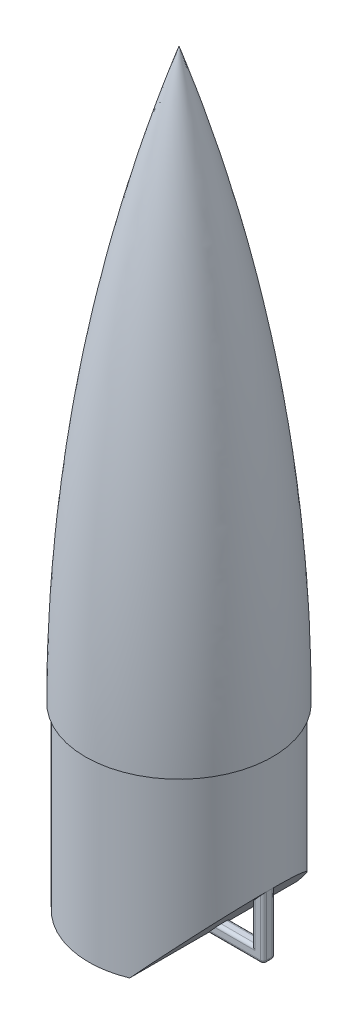
ISO-10303-21;
HEADER;
FILE_DESCRIPTION(('STEP AP214'),'2;1');
FILE_NAME('part.step','',(''),(''),'','','');
FILE_SCHEMA(('AUTOMOTIVE_DESIGN { 1 0 10303 214 1 1 1 1 }'));
ENDSEC;
DATA;
#1=APPLICATION_CONTEXT('core data for automotive mechanical design processes');
#2=APPLICATION_PROTOCOL_DEFINITION('international standard','automotive_design',2000,#1);
#3=PRODUCT_CONTEXT('',#1,'mechanical');
#4=PRODUCT('Part','Part','',(#3));
#5=PRODUCT_RELATED_PRODUCT_CATEGORY('part','',(#4));
#6=PRODUCT_DEFINITION_FORMATION('','',#4);
#7=PRODUCT_DEFINITION_CONTEXT('part definition',#1,'design');
#8=PRODUCT_DEFINITION('design','',#6,#7);
#9=PRODUCT_DEFINITION_SHAPE('','',#8);
#10=(LENGTH_UNIT() NAMED_UNIT(*) SI_UNIT(.MILLI.,.METRE.));
#11=(NAMED_UNIT(*) PLANE_ANGLE_UNIT() SI_UNIT($,.RADIAN.));
#12=(NAMED_UNIT(*) SI_UNIT($,.STERADIAN.) SOLID_ANGLE_UNIT());
#13=UNCERTAINTY_MEASURE_WITH_UNIT(LENGTH_MEASURE(1.E-05),#10,'distance_accuracy_value','');
#14=(GEOMETRIC_REPRESENTATION_CONTEXT(3) GLOBAL_UNCERTAINTY_ASSIGNED_CONTEXT((#13)) GLOBAL_UNIT_ASSIGNED_CONTEXT((#10,
#11,#12)) REPRESENTATION_CONTEXT('',''));
#15=CARTESIAN_POINT('',(0.,0.,0.));
#16=DIRECTION('',(0.,0.,1.));
#17=DIRECTION('',(1.,0.,0.));
#18=AXIS2_PLACEMENT_3D('',#15,#16,#17);
#19=CARTESIAN_POINT('',(0.,-73.025,0.));
#20=DIRECTION('',(0.,1.,0.));
#21=DIRECTION('',(0.,0.,1.));
#22=AXIS2_PLACEMENT_3D('',#19,#20,#21);
#23=PLANE('',#22);
#24=CARTESIAN_POINT('',(0.,-73.025,0.));
#25=DIRECTION('',(0.,-1.,0.));
#26=DIRECTION('',(0.,0.,-1.));
#27=AXIS2_PLACEMENT_3D('',#24,#25,#26);
#28=CIRCLE('',#27,6.6802);
#29=CARTESIAN_POINT('',(0.,-73.0249999999999,-6.6802));
#30=VERTEX_POINT('',#29);
#31=EDGE_CURVE('E322',#30,#30,#28,.T.);
#32=ORIENTED_EDGE('',*,*,#31,.F.);
#33=EDGE_LOOP('',(#32));
#34=FACE_BOUND('',#33,.T.);
#35=DIRECTION('',(0.,0.,1.));
#36=VECTOR('',#35,1.);
#37=CARTESIAN_POINT('',(13.97,-73.025,-38.1));
#38=LINE('',#37,#36);
#39=CARTESIAN_POINT('',(13.97,-73.025,-34.0776759770968));
#40=VERTEX_POINT('',#39);
#41=CARTESIAN_POINT('',(13.97,-73.025,-1.143));
#42=VERTEX_POINT('',#41);
#43=EDGE_CURVE('E175',#40,#42,#38,.T.);
#44=ORIENTED_EDGE('',*,*,#43,.T.);
#45=DIRECTION('',(1.,0.,0.));
#46=VECTOR('',#45,1.);
#47=CARTESIAN_POINT('',(0.,-73.025,-1.143));
#48=LINE('',#47,#46);
#49=CARTESIAN_POINT('',(35.56,-73.025,-1.143));
#50=VERTEX_POINT('',#49);
#51=EDGE_CURVE('E222',#42,#50,#48,.T.);
#52=ORIENTED_EDGE('',*,*,#51,.T.);
#53=DIRECTION('',(0.,0.,-1.));
#54=VECTOR('',#53,1.);
#55=CARTESIAN_POINT('',(35.56,-73.025,0.));
#56=LINE('',#55,#54);
#57=CARTESIAN_POINT('',(35.56,-73.025,1.143));
#58=VERTEX_POINT('',#57);
#59=EDGE_CURVE('E219',#50,#58,#56,.F.);
#60=ORIENTED_EDGE('',*,*,#59,.T.);
#61=DIRECTION('',(1.,0.,0.));
#62=VECTOR('',#61,1.);
#63=CARTESIAN_POINT('',(13.97,-73.025,1.143));
#64=LINE('',#63,#62);
#65=CARTESIAN_POINT('',(13.97,-73.025,1.14299999999998));
#66=VERTEX_POINT('',#65);
#67=EDGE_CURVE('E216',#58,#66,#64,.F.);
#68=ORIENTED_EDGE('',*,*,#67,.T.);
#69=CARTESIAN_POINT('',(13.97,-73.025,34.0776759770968));
#70=VERTEX_POINT('',#69);
#71=EDGE_CURVE('E184',#66,#70,#38,.T.);
#72=ORIENTED_EDGE('',*,*,#71,.T.);
#73=CARTESIAN_POINT('',(0.,-73.025,0.));
#74=DIRECTION('',(0.,1.,0.));
#75=DIRECTION('',(0.,0.,1.));
#76=AXIS2_PLACEMENT_3D('',#73,#74,#75);
#77=CIRCLE('',#76,36.83);
#78=EDGE_CURVE('E165',#40,#70,#77,.T.);
#79=ORIENTED_EDGE('',*,*,#78,.F.);
#80=EDGE_LOOP('',(#44,#52,#60,#68,#72,#79));
#81=FACE_BOUND('',#80,.T.);
#82=ADVANCED_FACE('F44',(#34,#81),#23,.F.);
#83=CARTESIAN_POINT('',(0.,55.,0.));
#84=DIRECTION('',(0.,1.,0.));
#85=DIRECTION('',(0.,0.,1.));
#86=AXIS2_PLACEMENT_3D('',#83,#84,#85);
#87=CYLINDRICAL_SURFACE('',#86,36.83);
#88=CARTESIAN_POINT('',(0.,0.,0.));
#89=DIRECTION('',(0.,1.,0.));
#90=DIRECTION('',(0.,0.,1.));
#91=AXIS2_PLACEMENT_3D('',#88,#89,#90);
#92=CIRCLE('',#91,36.83);
#93=CARTESIAN_POINT('',(0.,0.,36.83));
#94=VERTEX_POINT('',#93);
#95=EDGE_CURVE('E189',#94,#94,#92,.T.);
#96=ORIENTED_EDGE('',*,*,#95,.F.);
#97=EDGE_LOOP('',(#96));
#98=FACE_BOUND('',#97,.T.);
#99=CARTESIAN_POINT('',(0.,-88.5472222222222,0.));
#100=DIRECTION('',(-0.743294146247166,0.66896473162245,0.));
#101=DIRECTION('',(0.66896473162245,0.743294146247166,0.));
#102=AXIS2_PLACEMENT_3D('',#99,#100,#101);
#103=ELLIPSE('',#102,55.0552192948583,36.83);
#104=CARTESIAN_POINT('',(36.8033045655707,-47.6546615938103,1.40202462668802));
#105=VERTEX_POINT('',#104);
#106=EDGE_CURVE('E195',#70,#105,#103,.T.);
#107=ORIENTED_EDGE('',*,*,#106,.T.);
#108=CARTESIAN_POINT('',(36.83,-47.625,0.));
#109=VERTEX_POINT('',#108);
#110=EDGE_CURVE('E173',#105,#109,#103,.T.);
#111=ORIENTED_EDGE('',*,*,#110,.T.);
#112=CARTESIAN_POINT('',(36.8033045655707,-47.6546615938103,-1.40202462668819));
#113=VERTEX_POINT('',#112);
#114=EDGE_CURVE('E167',#109,#113,#103,.T.);
#115=ORIENTED_EDGE('',*,*,#114,.T.);
#116=EDGE_CURVE('E161',#113,#40,#103,.T.);
#117=ORIENTED_EDGE('',*,*,#116,.T.);
#118=ORIENTED_EDGE('',*,*,#78,.T.);
#119=EDGE_LOOP('',(#107,#111,#115,#117,#118));
#120=FACE_BOUND('',#119,.T.);
#121=ADVANCED_FACE('F163',(#98,#120),#87,.T.);
#122=CARTESIAN_POINT('',(36.83,0.,0.));
#123=DIRECTION('',(0.,1.,0.));
#124=DIRECTION('',(0.,0.,1.));
#125=AXIS2_PLACEMENT_3D('',#122,#123,#124);
#126=PLANE('',#125);
#127=CARTESIAN_POINT('',(0.,0.,0.));
#128=DIRECTION('',(0.,1.,0.));
#129=DIRECTION('',(0.,0.,1.));
#130=AXIS2_PLACEMENT_3D('',#127,#128,#129);
#131=CIRCLE('',#130,38.1);
#132=CARTESIAN_POINT('',(0.,0.,38.1));
#133=VERTEX_POINT('',#132);
#134=EDGE_CURVE('E183',#133,#133,#131,.T.);
#135=ORIENTED_EDGE('',*,*,#134,.F.);
#136=EDGE_LOOP('',(#135));
#137=FACE_BOUND('',#136,.T.);
#138=ORIENTED_EDGE('',*,*,#95,.T.);
#139=EDGE_LOOP('',(#138));
#140=FACE_BOUND('',#139,.T.);
#141=ADVANCED_FACE('F366',(#137,#140),#126,.F.);
#142=CARTESIAN_POINT('',(0.,0.,-685.932291666667));
#143=DIRECTION('',(-1.,0.,0.));
#144=DIRECTION('',(0.,0.,1.));
#145=AXIS2_PLACEMENT_3D('',#142,#143,#144);
#146=CIRCLE('',#145,724.032291666667);
#147=TRIMMED_CURVE('',#146,(PARAMETER_VALUE(-0.325852917700746)),
(PARAMETER_VALUE(0.325852917700746)),.T.,.PARAMETER.);
#148=CARTESIAN_POINT('',(0.,0.,0.));
#149=DIRECTION('',(0.,1.,0.));
#150=AXIS1_PLACEMENT('',#148,#149);
#151=SURFACE_OF_REVOLUTION('',#147,#150);
#152=CARTESIAN_POINT('',(0.,231.775,0.));
#153=VERTEX_POINT('',#152);
#154=VERTEX_LOOP('',#153);
#155=FACE_BOUND('',#154,.T.);
#156=ORIENTED_EDGE('',*,*,#134,.T.);
#157=EDGE_LOOP('',(#156));
#158=FACE_BOUND('',#157,.T.);
#159=ADVANCED_FACE('F453',(#155,#158),#151,.T.);
#160=CARTESIAN_POINT('',(36.83,-47.625,-38.1));
#161=DIRECTION('',(-0.743294146247166,0.66896473162245,0.));
#162=DIRECTION('',(-0.66896473162245,-0.743294146247166,0.));
#163=AXIS2_PLACEMENT_3D('',#160,#161,#162);
#164=PLANE('',#163);
#165=ORIENTED_EDGE('',*,*,#71,.F.);
#166=CARTESIAN_POINT('',(15.113,-71.755,1.143));
#167=DIRECTION('',(-0.743294146247166,0.66896473162245,0.));
#168=DIRECTION('',(-0.66896473162245,-0.743294146247166,0.));
#169=AXIS2_PLACEMENT_3D('',#166,#167,#168);
#170=ELLIPSE('',#169,1.70861025397836,1.27);
#171=CARTESIAN_POINT('',(15.113,-71.755,2.413));
#172=VERTEX_POINT('',#171);
#173=EDGE_CURVE('E287',#66,#172,#170,.T.);
#174=ORIENTED_EDGE('',*,*,#173,.T.);
#175=DIRECTION('',(-0.66896473162245,-0.743294146247166,0.));
#176=VECTOR('',#175,1.);
#177=CARTESIAN_POINT('',(13.97,-73.025,2.413));
#178=LINE('',#177,#176);
#179=CARTESIAN_POINT('',(17.1704,-69.469,2.413));
#180=VERTEX_POINT('',#179);
#181=EDGE_CURVE('E426',#180,#172,#178,.T.);
#182=ORIENTED_EDGE('',*,*,#181,.F.);
#183=CARTESIAN_POINT('',(17.1704,-69.469,1.143));
#184=DIRECTION('',(-0.743294146247166,0.66896473162245,0.));
#185=DIRECTION('',(0.66896473162245,0.743294146247166,0.));
#186=AXIS2_PLACEMENT_3D('',#183,#184,#185);
#187=ELLIPSE('',#186,1.70861025397836,1.27);
#188=CARTESIAN_POINT('',(18.3134,-68.199,1.143));
#189=VERTEX_POINT('',#188);
#190=EDGE_CURVE('E290',#180,#189,#187,.T.);
#191=ORIENTED_EDGE('',*,*,#190,.T.);
#192=DIRECTION('',(0.,0.,-1.));
#193=VECTOR('',#192,1.);
#194=CARTESIAN_POINT('',(18.3134,-68.199,2.413));
#195=LINE('',#194,#193);
#196=CARTESIAN_POINT('',(18.3134,-68.199,-1.143));
#197=VERTEX_POINT('',#196);
#198=EDGE_CURVE('E423',#189,#197,#195,.T.);
#199=ORIENTED_EDGE('',*,*,#198,.T.);
#200=CARTESIAN_POINT('',(17.1704,-69.469,-1.143));
#201=DIRECTION('',(-0.743294146247166,0.66896473162245,0.));
#202=DIRECTION('',(-0.66896473162245,-0.743294146247166,0.));
#203=AXIS2_PLACEMENT_3D('',#200,#201,#202);
#204=ELLIPSE('',#203,1.70861025397836,1.27);
#205=CARTESIAN_POINT('',(17.1704,-69.469,-2.413));
#206=VERTEX_POINT('',#205);
#207=EDGE_CURVE('E282',#197,#206,#204,.T.);
#208=ORIENTED_EDGE('',*,*,#207,.T.);
#209=DIRECTION('',(-0.66896473162245,-0.743294146247166,0.));
#210=VECTOR('',#209,1.);
#211=CARTESIAN_POINT('',(13.97,-73.025,-2.413));
#212=LINE('',#211,#210);
#213=CARTESIAN_POINT('',(15.113,-71.755,-2.413));
#214=VERTEX_POINT('',#213);
#215=EDGE_CURVE('E317',#206,#214,#212,.T.);
#216=ORIENTED_EDGE('',*,*,#215,.T.);
#217=CARTESIAN_POINT('',(15.113,-71.755,-1.143));
#218=DIRECTION('',(-0.743294146247166,0.66896473162245,0.));
#219=DIRECTION('',(0.66896473162245,0.743294146247166,0.));
#220=AXIS2_PLACEMENT_3D('',#217,#218,#219);
#221=ELLIPSE('',#220,1.70861025397836,1.27);
#222=EDGE_CURVE('E179',#214,#42,#221,.T.);
#223=ORIENTED_EDGE('',*,*,#222,.T.);
#224=ORIENTED_EDGE('',*,*,#43,.F.);
#225=ORIENTED_EDGE('',*,*,#116,.F.);
#226=CARTESIAN_POINT('',(35.56,-49.0361111111111,-1.143));
#227=DIRECTION('',(-0.743294146247166,0.66896473162245,0.));
#228=DIRECTION('',(0.66896473162245,0.743294146247166,0.));
#229=AXIS2_PLACEMENT_3D('',#226,#227,#228);
#230=ELLIPSE('',#229,1.89845583775373,1.27);
#231=CARTESIAN_POINT('',(35.56,-49.0361111111111,-2.413));
#232=VERTEX_POINT('',#231);
#233=EDGE_CURVE('E279',#113,#232,#230,.T.);
#234=ORIENTED_EDGE('',*,*,#233,.T.);
#235=DIRECTION('',(0.66896473162245,0.743294146247166,0.));
#236=VECTOR('',#235,1.);
#237=CARTESIAN_POINT('',(36.83,-47.625,-2.413));
#238=LINE('',#237,#236);
#239=CARTESIAN_POINT('',(33.274,-51.5761111111111,-2.413));
#240=VERTEX_POINT('',#239);
#241=EDGE_CURVE('E198',#240,#232,#238,.T.);
#242=ORIENTED_EDGE('',*,*,#241,.F.);
#243=CARTESIAN_POINT('',(33.274,-51.5761111111111,-1.143));
#244=DIRECTION('',(-0.743294146247166,0.66896473162245,0.));
#245=DIRECTION('',(-0.66896473162245,-0.743294146247166,0.));
#246=AXIS2_PLACEMENT_3D('',#243,#244,#245);
#247=ELLIPSE('',#246,1.89845583775373,1.27);
#248=CARTESIAN_POINT('',(32.004,-52.9872222222222,-1.143));
#249=VERTEX_POINT('',#248);
#250=EDGE_CURVE('E273',#240,#249,#247,.T.);
#251=ORIENTED_EDGE('',*,*,#250,.T.);
#252=DIRECTION('',(0.,0.,-1.));
#253=VECTOR('',#252,1.);
#254=CARTESIAN_POINT('',(32.004,-52.9872222222222,2.413));
#255=LINE('',#254,#253);
#256=CARTESIAN_POINT('',(32.004,-52.9872222222222,1.143));
#257=VERTEX_POINT('',#256);
#258=EDGE_CURVE('E437',#257,#249,#255,.T.);
#259=ORIENTED_EDGE('',*,*,#258,.F.);
#260=CARTESIAN_POINT('',(33.274,-51.5761111111111,1.143));
#261=DIRECTION('',(-0.743294146247166,0.66896473162245,0.));
#262=DIRECTION('',(0.66896473162245,0.743294146247166,0.));
#263=AXIS2_PLACEMENT_3D('',#260,#261,#262);
#264=ELLIPSE('',#263,1.89845583775373,1.27);
#265=CARTESIAN_POINT('',(33.274,-51.5761111111111,2.413));
#266=VERTEX_POINT('',#265);
#267=EDGE_CURVE('E276',#257,#266,#264,.T.);
#268=ORIENTED_EDGE('',*,*,#267,.T.);
#269=DIRECTION('',(0.66896473162245,0.743294146247166,0.));
#270=VECTOR('',#269,1.);
#271=CARTESIAN_POINT('',(36.83,-47.625,2.413));
#272=LINE('',#271,#270);
#273=CARTESIAN_POINT('',(35.56,-49.0361111111111,2.413));
#274=VERTEX_POINT('',#273);
#275=EDGE_CURVE('E202',#266,#274,#272,.T.);
#276=ORIENTED_EDGE('',*,*,#275,.T.);
#277=CARTESIAN_POINT('',(35.56,-49.0361111111111,1.143));
#278=DIRECTION('',(-0.743294146247166,0.66896473162245,0.));
#279=DIRECTION('',(-0.66896473162245,-0.743294146247166,0.));
#280=AXIS2_PLACEMENT_3D('',#277,#278,#279);
#281=ELLIPSE('',#280,1.89845583775373,1.27);
#282=EDGE_CURVE('E269',#274,#105,#281,.T.);
#283=ORIENTED_EDGE('',*,*,#282,.T.);
#284=ORIENTED_EDGE('',*,*,#106,.F.);
#285=EDGE_LOOP('',(#165,#174,#182,#191,#199,#208,#216,#223,#224,#225,#234,#242,#251,#259,#268,
#276,#283,#284));
#286=FACE_BOUND('',#285,.T.);
#287=ADVANCED_FACE('F176',(#286),#164,.F.);
#288=CARTESIAN_POINT('',(32.004,-52.9872222222222,2.413));
#289=DIRECTION('',(0.743294146247167,-0.668964731622449,0.));
#290=DIRECTION('',(0.668964731622449,0.743294146247167,0.));
#291=AXIS2_PLACEMENT_3D('',#288,#289,#290);
#292=PLANE('',#291);
#293=ORIENTED_EDGE('',*,*,#110,.F.);
#294=CARTESIAN_POINT('',(35.56,-49.0361111111111,1.143));
#295=DIRECTION('',(0.743294146247167,-0.668964731622449,0.));
#296=DIRECTION('',(-0.668964731622449,-0.743294146247167,0.));
#297=AXIS2_PLACEMENT_3D('',#294,#295,#296);
#298=ELLIPSE('',#297,1.89845583775374,1.27);
#299=CARTESIAN_POINT('',(36.83,-47.625,1.143));
#300=VERTEX_POINT('',#299);
#301=EDGE_CURVE('E238',#105,#300,#298,.F.);
#302=ORIENTED_EDGE('',*,*,#301,.T.);
#303=DIRECTION('',(0.,0.,-1.));
#304=VECTOR('',#303,1.);
#305=CARTESIAN_POINT('',(36.83,-47.625,2.413));
#306=LINE('',#305,#304);
#307=EDGE_CURVE('E446',#300,#109,#306,.T.);
#308=ORIENTED_EDGE('',*,*,#307,.T.);
#309=EDGE_LOOP('',(#293,#302,#308));
#310=FACE_BOUND('',#309,.T.);
#311=ADVANCED_FACE('F467',(#310),#292,.F.);
#312=CARTESIAN_POINT('',(36.83,-47.625,2.413));
#313=DIRECTION('',(-1.,0.,0.));
#314=DIRECTION('',(0.,0.,1.));
#315=AXIS2_PLACEMENT_3D('',#312,#313,#314);
#316=PLANE('',#315);
#317=ORIENTED_EDGE('',*,*,#307,.F.);
#318=DIRECTION('',(0.,1.,0.));
#319=VECTOR('',#318,1.);
#320=CARTESIAN_POINT('',(36.83,-73.025,1.143));
#321=LINE('',#320,#319);
#322=CARTESIAN_POINT('',(36.83,-71.755,1.143));
#323=VERTEX_POINT('',#322);
#324=EDGE_CURVE('E213',#300,#323,#321,.F.);
#325=ORIENTED_EDGE('',*,*,#324,.T.);
#326=DIRECTION('',(0.,0.,-1.));
#327=VECTOR('',#326,1.);
#328=CARTESIAN_POINT('',(36.83,-71.755,2.413));
#329=LINE('',#328,#327);
#330=CARTESIAN_POINT('',(36.83,-71.755,-1.143));
#331=VERTEX_POINT('',#330);
#332=EDGE_CURVE('E209',#323,#331,#329,.T.);
#333=ORIENTED_EDGE('',*,*,#332,.T.);
#334=DIRECTION('',(0.,1.,0.));
#335=VECTOR('',#334,1.);
#336=CARTESIAN_POINT('',(36.83,-47.625,-1.143));
#337=LINE('',#336,#335);
#338=CARTESIAN_POINT('',(36.83,-47.625,-1.143));
#339=VERTEX_POINT('',#338);
#340=EDGE_CURVE('E206',#331,#339,#337,.T.);
#341=ORIENTED_EDGE('',*,*,#340,.T.);
#342=EDGE_CURVE('E445',#109,#339,#306,.T.);
#343=ORIENTED_EDGE('',*,*,#342,.F.);
#344=EDGE_LOOP('',(#317,#325,#333,#341,#343));
#345=FACE_BOUND('',#344,.T.);
#346=ADVANCED_FACE('F468',(#345),#316,.F.);
#347=ORIENTED_EDGE('',*,*,#342,.T.);
#348=CARTESIAN_POINT('',(35.56,-49.0361111111111,-1.143));
#349=DIRECTION('',(0.743294146247167,-0.668964731622449,0.));
#350=DIRECTION('',(0.668964731622449,0.743294146247167,0.));
#351=AXIS2_PLACEMENT_3D('',#348,#349,#350);
#352=ELLIPSE('',#351,1.89845583775374,1.27);
#353=EDGE_CURVE('E260',#339,#113,#352,.F.);
#354=ORIENTED_EDGE('',*,*,#353,.T.);
#355=ORIENTED_EDGE('',*,*,#114,.F.);
#356=EDGE_LOOP('',(#347,#354,#355));
#357=FACE_BOUND('',#356,.T.);
#358=ADVANCED_FACE('F471',(#357),#292,.F.);
#359=CARTESIAN_POINT('',(32.004,-52.9872222222222,2.413));
#360=DIRECTION('',(1.,0.,0.));
#361=DIRECTION('',(0.,0.,-1.));
#362=AXIS2_PLACEMENT_3D('',#359,#360,#361);
#363=PLANE('',#362);
#364=ORIENTED_EDGE('',*,*,#258,.T.);
#365=DIRECTION('',(0.,-1.,0.));
#366=VECTOR('',#365,1.);
#367=CARTESIAN_POINT('',(32.004,-52.9872222222222,-1.143));
#368=LINE('',#367,#366);
#369=CARTESIAN_POINT('',(32.004,-68.199,-1.143));
#370=VERTEX_POINT('',#369);
#371=EDGE_CURVE('E244',#249,#370,#368,.T.);
#372=ORIENTED_EDGE('',*,*,#371,.T.);
#373=DIRECTION('',(0.,0.,-1.));
#374=VECTOR('',#373,1.);
#375=CARTESIAN_POINT('',(32.004,-68.199,2.413));
#376=LINE('',#375,#374);
#377=CARTESIAN_POINT('',(32.004,-68.199,1.143));
#378=VERTEX_POINT('',#377);
#379=EDGE_CURVE('E433',#378,#370,#376,.T.);
#380=ORIENTED_EDGE('',*,*,#379,.F.);
#381=DIRECTION('',(0.,-1.,0.));
#382=VECTOR('',#381,1.);
#383=CARTESIAN_POINT('',(32.004,-52.9872222222222,1.143));
#384=LINE('',#383,#382);
#385=EDGE_CURVE('E241',#378,#257,#384,.F.);
#386=ORIENTED_EDGE('',*,*,#385,.T.);
#387=EDGE_LOOP('',(#364,#372,#380,#386));
#388=FACE_BOUND('',#387,.T.);
#389=ADVANCED_FACE('F475',(#388),#363,.F.);
#390=CARTESIAN_POINT('',(32.004,-68.199,2.413));
#391=DIRECTION('',(0.,-1.,0.));
#392=DIRECTION('',(0.,0.,-1.));
#393=AXIS2_PLACEMENT_3D('',#390,#391,#392);
#394=PLANE('',#393);
#395=ORIENTED_EDGE('',*,*,#379,.T.);
#396=DIRECTION('',(-1.,0.,0.));
#397=VECTOR('',#396,1.);
#398=CARTESIAN_POINT('',(32.004,-68.199,-1.143));
#399=LINE('',#398,#397);
#400=EDGE_CURVE('E266',#370,#197,#399,.T.);
#401=ORIENTED_EDGE('',*,*,#400,.T.);
#402=ORIENTED_EDGE('',*,*,#198,.F.);
#403=DIRECTION('',(-1.,0.,0.));
#404=VECTOR('',#403,1.);
#405=CARTESIAN_POINT('',(32.004,-68.199,1.143));
#406=LINE('',#405,#404);
#407=EDGE_CURVE('E263',#189,#378,#406,.F.);
#408=ORIENTED_EDGE('',*,*,#407,.T.);
#409=EDGE_LOOP('',(#395,#401,#402,#408));
#410=FACE_BOUND('',#409,.T.);
#411=ADVANCED_FACE('F429',(#410),#394,.F.);
#412=CARTESIAN_POINT('',(0.,0.,2.413));
#413=DIRECTION('',(0.,0.,1.));
#414=DIRECTION('',(1.,0.,0.));
#415=AXIS2_PLACEMENT_3D('',#412,#413,#414);
#416=PLANE('',#415);
#417=DIRECTION('',(1.,0.,0.));
#418=VECTOR('',#417,1.);
#419=CARTESIAN_POINT('',(36.83,-71.755,2.413));
#420=LINE('',#419,#418);
#421=CARTESIAN_POINT('',(35.56,-71.755,2.413));
#422=VERTEX_POINT('',#421);
#423=EDGE_CURVE('E232',#172,#422,#420,.T.);
#424=ORIENTED_EDGE('',*,*,#423,.T.);
#425=DIRECTION('',(0.,1.,0.));
#426=VECTOR('',#425,1.);
#427=CARTESIAN_POINT('',(35.56,-47.625,2.413));
#428=LINE('',#427,#426);
#429=EDGE_CURVE('E235',#422,#274,#428,.T.);
#430=ORIENTED_EDGE('',*,*,#429,.T.);
#431=ORIENTED_EDGE('',*,*,#275,.F.);
#432=DIRECTION('',(0.,-1.,0.));
#433=VECTOR('',#432,1.);
#434=CARTESIAN_POINT('',(33.274,-68.199,2.413));
#435=LINE('',#434,#433);
#436=CARTESIAN_POINT('',(33.274,-69.469,2.413));
#437=VERTEX_POINT('',#436);
#438=EDGE_CURVE('E228',#266,#437,#435,.T.);
#439=ORIENTED_EDGE('',*,*,#438,.T.);
#440=DIRECTION('',(-1.,0.,0.));
#441=VECTOR('',#440,1.);
#442=CARTESIAN_POINT('',(18.3134,-69.469,2.413));
#443=LINE('',#442,#441);
#444=EDGE_CURVE('E225',#437,#180,#443,.T.);
#445=ORIENTED_EDGE('',*,*,#444,.T.);
#446=ORIENTED_EDGE('',*,*,#181,.T.);
#447=EDGE_LOOP('',(#424,#430,#431,#439,#445,#446));
#448=FACE_BOUND('',#447,.T.);
#449=ADVANCED_FACE('F482',(#448),#416,.T.);
#450=CARTESIAN_POINT('',(0.,0.,-2.413));
#451=DIRECTION('',(0.,0.,1.));
#452=DIRECTION('',(1.,0.,0.));
#453=AXIS2_PLACEMENT_3D('',#450,#451,#452);
#454=PLANE('',#453);
#455=DIRECTION('',(-1.,0.,0.));
#456=VECTOR('',#455,1.);
#457=CARTESIAN_POINT('',(0.,-69.469,-2.413));
#458=LINE('',#457,#456);
#459=CARTESIAN_POINT('',(33.274,-69.469,-2.413));
#460=VERTEX_POINT('',#459);
#461=EDGE_CURVE('E254',#206,#460,#458,.F.);
#462=ORIENTED_EDGE('',*,*,#461,.T.);
#463=DIRECTION('',(0.,-1.,0.));
#464=VECTOR('',#463,1.);
#465=CARTESIAN_POINT('',(33.274,0.,-2.413));
#466=LINE('',#465,#464);
#467=EDGE_CURVE('E257',#460,#240,#466,.F.);
#468=ORIENTED_EDGE('',*,*,#467,.T.);
#469=ORIENTED_EDGE('',*,*,#241,.T.);
#470=DIRECTION('',(0.,1.,0.));
#471=VECTOR('',#470,1.);
#472=CARTESIAN_POINT('',(35.56,0.,-2.413));
#473=LINE('',#472,#471);
#474=CARTESIAN_POINT('',(35.56,-71.755,-2.413));
#475=VERTEX_POINT('',#474);
#476=EDGE_CURVE('E251',#232,#475,#473,.F.);
#477=ORIENTED_EDGE('',*,*,#476,.T.);
#478=DIRECTION('',(1.,0.,0.));
#479=VECTOR('',#478,1.);
#480=CARTESIAN_POINT('',(0.,-71.755,-2.413));
#481=LINE('',#480,#479);
#482=EDGE_CURVE('E248',#475,#214,#481,.F.);
#483=ORIENTED_EDGE('',*,*,#482,.T.);
#484=ORIENTED_EDGE('',*,*,#215,.F.);
#485=EDGE_LOOP('',(#462,#468,#469,#477,#483,#484));
#486=FACE_BOUND('',#485,.T.);
#487=ADVANCED_FACE('F400',(#486),#454,.F.);
#488=CARTESIAN_POINT('',(0.,-71.755,1.143));
#489=DIRECTION('',(-1.,0.,0.));
#490=DIRECTION('',(0.,0.,1.));
#491=AXIS2_PLACEMENT_3D('',#488,#489,#490);
#492=CYLINDRICAL_SURFACE('',#491,1.27);
#493=ORIENTED_EDGE('',*,*,#173,.F.);
#494=ORIENTED_EDGE('',*,*,#67,.F.);
#495=CARTESIAN_POINT('',(35.56,-71.755,1.143));
#496=DIRECTION('',(1.,0.,0.));
#497=DIRECTION('',(0.,0.,-1.));
#498=AXIS2_PLACEMENT_3D('',#495,#496,#497);
#499=CIRCLE('',#498,1.27);
#500=EDGE_CURVE('E313',#422,#58,#499,.T.);
#501=ORIENTED_EDGE('',*,*,#500,.F.);
#502=ORIENTED_EDGE('',*,*,#423,.F.);
#503=EDGE_LOOP('',(#493,#494,#501,#502));
#504=FACE_BOUND('',#503,.T.);
#505=ADVANCED_FACE('F396',(#504),#492,.T.);
#506=CARTESIAN_POINT('',(35.56,0.,1.143));
#507=DIRECTION('',(0.,-1.,0.));
#508=DIRECTION('',(0.,0.,-1.));
#509=AXIS2_PLACEMENT_3D('',#506,#507,#508);
#510=CYLINDRICAL_SURFACE('',#509,1.27);
#511=ORIENTED_EDGE('',*,*,#282,.F.);
#512=ORIENTED_EDGE('',*,*,#429,.F.);
#513=CARTESIAN_POINT('',(35.56,-71.755,1.143));
#514=DIRECTION('',(0.,-1.,0.));
#515=DIRECTION('',(0.,0.,-1.));
#516=AXIS2_PLACEMENT_3D('',#513,#514,#515);
#517=CIRCLE('',#516,1.27);
#518=EDGE_CURVE('E309',#323,#422,#517,.T.);
#519=ORIENTED_EDGE('',*,*,#518,.F.);
#520=ORIENTED_EDGE('',*,*,#324,.F.);
#521=ORIENTED_EDGE('',*,*,#301,.F.);
#522=EDGE_LOOP('',(#511,#512,#519,#520,#521));
#523=FACE_BOUND('',#522,.T.);
#524=ADVANCED_FACE('F392',(#523),#510,.T.);
#525=CARTESIAN_POINT('',(35.56,-47.625,-1.143));
#526=DIRECTION('',(0.,1.,0.));
#527=DIRECTION('',(0.,0.,1.));
#528=AXIS2_PLACEMENT_3D('',#525,#526,#527);
#529=CYLINDRICAL_SURFACE('',#528,1.27);
#530=ORIENTED_EDGE('',*,*,#353,.F.);
#531=ORIENTED_EDGE('',*,*,#340,.F.);
#532=CARTESIAN_POINT('',(35.56,-71.755,-1.143));
#533=DIRECTION('',(0.,-1.,0.));
#534=DIRECTION('',(0.,0.,-1.));
#535=AXIS2_PLACEMENT_3D('',#532,#533,#534);
#536=CIRCLE('',#535,1.27);
#537=EDGE_CURVE('E305',#475,#331,#536,.T.);
#538=ORIENTED_EDGE('',*,*,#537,.F.);
#539=ORIENTED_EDGE('',*,*,#476,.F.);
#540=ORIENTED_EDGE('',*,*,#233,.F.);
#541=EDGE_LOOP('',(#530,#531,#538,#539,#540));
#542=FACE_BOUND('',#541,.T.);
#543=ADVANCED_FACE('F388',(#542),#529,.T.);
#544=CARTESIAN_POINT('',(0.,-71.755,-1.143));
#545=DIRECTION('',(1.,0.,0.));
#546=DIRECTION('',(0.,0.,-1.));
#547=AXIS2_PLACEMENT_3D('',#544,#545,#546);
#548=CYLINDRICAL_SURFACE('',#547,1.27);
#549=ORIENTED_EDGE('',*,*,#222,.F.);
#550=ORIENTED_EDGE('',*,*,#482,.F.);
#551=CARTESIAN_POINT('',(35.56,-71.755,-1.143));
#552=DIRECTION('',(1.,0.,0.));
#553=DIRECTION('',(0.,0.,-1.));
#554=AXIS2_PLACEMENT_3D('',#551,#552,#553);
#555=CIRCLE('',#554,1.27);
#556=EDGE_CURVE('E301',#50,#475,#555,.T.);
#557=ORIENTED_EDGE('',*,*,#556,.F.);
#558=ORIENTED_EDGE('',*,*,#51,.F.);
#559=EDGE_LOOP('',(#549,#550,#557,#558));
#560=FACE_BOUND('',#559,.T.);
#561=ADVANCED_FACE('F384',(#560),#548,.T.);
#562=CARTESIAN_POINT('',(35.56,-71.755,1.143));
#563=DIRECTION('',(0.,0.,1.));
#564=DIRECTION('',(1.,0.,0.));
#565=AXIS2_PLACEMENT_3D('',#562,#563,#564);
#566=SPHERICAL_SURFACE('',#565,1.27);
#567=ORIENTED_EDGE('',*,*,#518,.T.);
#568=ORIENTED_EDGE('',*,*,#500,.T.);
#569=CARTESIAN_POINT('',(35.56,-71.755,1.143));
#570=DIRECTION('',(0.,0.,1.));
#571=DIRECTION('',(1.,0.,0.));
#572=AXIS2_PLACEMENT_3D('',#569,#570,#571);
#573=CIRCLE('',#572,1.27);
#574=EDGE_CURVE('E296',#323,#58,#573,.F.);
#575=ORIENTED_EDGE('',*,*,#574,.F.);
#576=EDGE_LOOP('',(#567,#568,#575));
#577=FACE_BOUND('',#576,.T.);
#578=ADVANCED_FACE('F380',(#577),#566,.T.);
#579=CARTESIAN_POINT('',(35.56,-71.755,-1.143));
#580=DIRECTION('',(0.,0.,-1.));
#581=DIRECTION('',(-1.,0.,0.));
#582=AXIS2_PLACEMENT_3D('',#579,#580,#581);
#583=SPHERICAL_SURFACE('',#582,1.27);
#584=ORIENTED_EDGE('',*,*,#556,.T.);
#585=ORIENTED_EDGE('',*,*,#537,.T.);
#586=CARTESIAN_POINT('',(35.56,-71.755,-1.143));
#587=DIRECTION('',(0.,0.,-1.));
#588=DIRECTION('',(0.,1.,0.));
#589=AXIS2_PLACEMENT_3D('',#586,#587,#588);
#590=CIRCLE('',#589,1.27);
#591=EDGE_CURVE('E293',#50,#331,#590,.F.);
#592=ORIENTED_EDGE('',*,*,#591,.F.);
#593=EDGE_LOOP('',(#584,#585,#592));
#594=FACE_BOUND('',#593,.T.);
#595=ADVANCED_FACE('F376',(#594),#583,.T.);
#596=CARTESIAN_POINT('',(35.56,-71.755,2.413));
#597=DIRECTION('',(0.,0.,-1.));
#598=DIRECTION('',(-1.,0.,0.));
#599=AXIS2_PLACEMENT_3D('',#596,#597,#598);
#600=CYLINDRICAL_SURFACE('',#599,1.27);
#601=ORIENTED_EDGE('',*,*,#574,.T.);
#602=ORIENTED_EDGE('',*,*,#59,.F.);
#603=ORIENTED_EDGE('',*,*,#591,.T.);
#604=ORIENTED_EDGE('',*,*,#332,.F.);
#605=EDGE_LOOP('',(#601,#602,#603,#604));
#606=FACE_BOUND('',#605,.T.);
#607=ADVANCED_FACE('F372',(#606),#600,.T.);
#608=CARTESIAN_POINT('',(32.004,-69.469,-1.143));
#609=DIRECTION('',(-1.,0.,0.));
#610=DIRECTION('',(0.,0.,1.));
#611=AXIS2_PLACEMENT_3D('',#608,#609,#610);
#612=CYLINDRICAL_SURFACE('',#611,1.27);
#613=ORIENTED_EDGE('',*,*,#207,.F.);
#614=ORIENTED_EDGE('',*,*,#400,.F.);
#615=CARTESIAN_POINT('',(33.274,-69.469,-1.143));
#616=DIRECTION('',(-0.707106781186547,-0.707106781186547,0.));
#617=DIRECTION('',(0.707106781186547,-0.707106781186547,0.));
#618=AXIS2_PLACEMENT_3D('',#615,#616,#617);
#619=ELLIPSE('',#618,1.79605122421383,1.27);
#620=EDGE_CURVE('E297',#460,#370,#619,.F.);
#621=ORIENTED_EDGE('',*,*,#620,.F.);
#622=ORIENTED_EDGE('',*,*,#461,.F.);
#623=EDGE_LOOP('',(#613,#614,#621,#622));
#624=FACE_BOUND('',#623,.T.);
#625=ADVANCED_FACE('F375',(#624),#612,.T.);
#626=CARTESIAN_POINT('',(33.274,-52.9872222222222,-1.143));
#627=DIRECTION('',(0.,-1.,0.));
#628=DIRECTION('',(0.,0.,-1.));
#629=AXIS2_PLACEMENT_3D('',#626,#627,#628);
#630=CYLINDRICAL_SURFACE('',#629,1.27);
#631=ORIENTED_EDGE('',*,*,#250,.F.);
#632=ORIENTED_EDGE('',*,*,#467,.F.);
#633=ORIENTED_EDGE('',*,*,#620,.T.);
#634=ORIENTED_EDGE('',*,*,#371,.F.);
#635=EDGE_LOOP('',(#631,#632,#633,#634));
#636=FACE_BOUND('',#635,.T.);
#637=ADVANCED_FACE('F402',(#636),#630,.T.);
#638=CARTESIAN_POINT('',(0.,-69.469,1.143));
#639=DIRECTION('',(1.,0.,0.));
#640=DIRECTION('',(0.,0.,-1.));
#641=AXIS2_PLACEMENT_3D('',#638,#639,#640);
#642=CYLINDRICAL_SURFACE('',#641,1.27);
#643=ORIENTED_EDGE('',*,*,#190,.F.);
#644=ORIENTED_EDGE('',*,*,#444,.F.);
#645=CARTESIAN_POINT('',(33.274,-69.469,1.143));
#646=DIRECTION('',(0.707106781186547,0.707106781186547,0.));
#647=DIRECTION('',(-0.707106781186547,0.707106781186547,0.));
#648=AXIS2_PLACEMENT_3D('',#645,#646,#647);
#649=ELLIPSE('',#648,1.79605122421383,1.27);
#650=EDGE_CURVE('E320',#378,#437,#649,.T.);
#651=ORIENTED_EDGE('',*,*,#650,.F.);
#652=ORIENTED_EDGE('',*,*,#407,.F.);
#653=EDGE_LOOP('',(#643,#644,#651,#652));
#654=FACE_BOUND('',#653,.T.);
#655=ADVANCED_FACE('F405',(#654),#642,.T.);
#656=CARTESIAN_POINT('',(33.274,0.,1.143));
#657=DIRECTION('',(0.,1.,0.));
#658=DIRECTION('',(0.,0.,1.));
#659=AXIS2_PLACEMENT_3D('',#656,#657,#658);
#660=CYLINDRICAL_SURFACE('',#659,1.27);
#661=ORIENTED_EDGE('',*,*,#267,.F.);
#662=ORIENTED_EDGE('',*,*,#385,.F.);
#663=ORIENTED_EDGE('',*,*,#650,.T.);
#664=ORIENTED_EDGE('',*,*,#438,.F.);
#665=EDGE_LOOP('',(#661,#662,#663,#664));
#666=FACE_BOUND('',#665,.T.);
#667=ADVANCED_FACE('F354',(#666),#660,.T.);
#668=CARTESIAN_POINT('',(0.,231.776,0.));
#669=DIRECTION('',(0.,-1.,0.));
#670=DIRECTION('',(0.,0.,-1.));
#671=AXIS2_PLACEMENT_3D('',#668,#669,#670);
#672=CYLINDRICAL_SURFACE('',#671,6.6802);
#673=CARTESIAN_POINT('',(0.,-70.485,0.));
#674=DIRECTION('',(0.,1.,0.));
#675=DIRECTION('',(0.,0.,1.));
#676=AXIS2_PLACEMENT_3D('',#673,#674,#675);
#677=CIRCLE('',#676,6.6802);
#678=CARTESIAN_POINT('',(0.,-70.4850000000001,-6.6802));
#679=VERTEX_POINT('',#678);
#680=EDGE_CURVE('E527',#679,#679,#677,.F.);
#681=CARTESIAN_POINT('',(0.,-70.4850000000001,-6.6802));
#682=CARTESIAN_POINT('',(0.,-70.5114583333334,-6.6802));
#683=CARTESIAN_POINT('',(0.,-70.5379166666667,-6.6802));
#684=CARTESIAN_POINT('',(0.,-70.5908333333334,-6.6802));
#685=CARTESIAN_POINT('',(0.,-70.6172916666667,-6.6802));
#686=CARTESIAN_POINT('',(0.,-70.6702083333334,-6.6802));
#687=CARTESIAN_POINT('',(0.,-70.6966666666667,-6.6802));
#688=CARTESIAN_POINT('',(0.,-70.7495833333334,-6.6802));
#689=CARTESIAN_POINT('',(0.,-70.7760416666667,-6.6802));
#690=CARTESIAN_POINT('',(0.,-70.8289583333334,-6.6802));
#691=CARTESIAN_POINT('',(0.,-70.8554166666667,-6.6802));
#692=CARTESIAN_POINT('',(0.,-70.9083333333334,-6.6802));
#693=CARTESIAN_POINT('',(0.,-70.9347916666667,-6.6802));
#694=CARTESIAN_POINT('',(0.,-70.9877083333334,-6.6802));
#695=CARTESIAN_POINT('',(0.,-71.0141666666667,-6.6802));
#696=CARTESIAN_POINT('',(0.,-71.0670833333333,-6.6802));
#697=CARTESIAN_POINT('',(0.,-71.0935416666667,-6.6802));
#698=CARTESIAN_POINT('',(0.,-71.1464583333334,-6.6802));
#699=CARTESIAN_POINT('',(0.,-71.1729166666667,-6.6802));
#700=CARTESIAN_POINT('',(0.,-71.2258333333334,-6.6802));
#701=CARTESIAN_POINT('',(0.,-71.2522916666667,-6.6802));
#702=CARTESIAN_POINT('',(0.,-71.3052083333334,-6.6802));
#703=CARTESIAN_POINT('',(0.,-71.3316666666667,-6.6802));
#704=CARTESIAN_POINT('',(0.,-71.3845833333334,-6.6802));
#705=CARTESIAN_POINT('',(0.,-71.4110416666667,-6.6802));
#706=CARTESIAN_POINT('',(0.,-71.4639583333334,-6.6802));
#707=CARTESIAN_POINT('',(0.,-71.4904166666667,-6.6802));
#708=CARTESIAN_POINT('',(0.,-71.5433333333334,-6.6802));
#709=CARTESIAN_POINT('',(0.,-71.5697916666667,-6.6802));
#710=CARTESIAN_POINT('',(0.,-71.6227083333333,-6.6802));
#711=CARTESIAN_POINT('',(0.,-71.6491666666667,-6.6802));
#712=CARTESIAN_POINT('',(0.,-71.7020833333333,-6.6802));
#713=CARTESIAN_POINT('',(0.,-71.7285416666667,-6.6802));
#714=CARTESIAN_POINT('',(0.,-71.7814583333333,-6.6802));
#715=CARTESIAN_POINT('',(0.,-71.8079166666667,-6.6802));
#716=CARTESIAN_POINT('',(0.,-71.8608333333333,-6.6802));
#717=CARTESIAN_POINT('',(0.,-71.8872916666667,-6.6802));
#718=CARTESIAN_POINT('',(0.,-71.9402083333333,-6.6802));
#719=CARTESIAN_POINT('',(0.,-71.9666666666667,-6.6802));
#720=CARTESIAN_POINT('',(0.,-72.0195833333333,-6.6802));
#721=CARTESIAN_POINT('',(0.,-72.0460416666667,-6.6802));
#722=CARTESIAN_POINT('',(0.,-72.0989583333333,-6.6802));
#723=CARTESIAN_POINT('',(0.,-72.1254166666667,-6.6802));
#724=CARTESIAN_POINT('',(0.,-72.1783333333333,-6.6802));
#725=CARTESIAN_POINT('',(0.,-72.2047916666666,-6.6802));
#726=CARTESIAN_POINT('',(0.,-72.2577083333333,-6.6802));
#727=CARTESIAN_POINT('',(0.,-72.2841666666666,-6.6802));
#728=CARTESIAN_POINT('',(0.,-72.3370833333333,-6.6802));
#729=CARTESIAN_POINT('',(0.,-72.3635416666667,-6.6802));
#730=CARTESIAN_POINT('',(0.,-72.4164583333333,-6.6802));
#731=CARTESIAN_POINT('',(0.,-72.4429166666667,-6.6802));
#732=CARTESIAN_POINT('',(0.,-72.4958333333333,-6.6802));
#733=CARTESIAN_POINT('',(0.,-72.5222916666667,-6.6802));
#734=CARTESIAN_POINT('',(0.,-72.5752083333333,-6.6802));
#735=CARTESIAN_POINT('',(0.,-72.6016666666667,-6.6802));
#736=CARTESIAN_POINT('',(0.,-72.6545833333333,-6.6802));
#737=CARTESIAN_POINT('',(0.,-72.6810416666667,-6.6802));
#738=CARTESIAN_POINT('',(0.,-72.7339583333333,-6.6802));
#739=CARTESIAN_POINT('',(0.,-72.7604166666666,-6.6802));
#740=CARTESIAN_POINT('',(0.,-72.8133333333333,-6.6802));
#741=CARTESIAN_POINT('',(0.,-72.8397916666666,-6.6802));
#742=CARTESIAN_POINT('',(0.,-72.8927083333333,-6.6802));
#743=CARTESIAN_POINT('',(0.,-72.9191666666666,-6.6802));
#744=CARTESIAN_POINT('',(0.,-72.9720833333333,-6.6802));
#745=CARTESIAN_POINT('',(0.,-72.9985416666666,-6.6802));
#746=CARTESIAN_POINT('',(0.,-73.0249999999999,-6.6802));
#747=B_SPLINE_CURVE_WITH_KNOTS('',3,(#681,#682,#683,#684,#685,#686,#687,#688,#689,#690,#691,
#692,#693,#694,#695,#696,#697,#698,#699,#700,#701,#702,#703,#704,#705,#706,#707,#708,#709,#710,
#711,#712,#713,#714,#715,#716,#717,#718,#719,#720,#721,#722,#723,#724,#725,#726,#727,#728,#729,
#730,#731,#732,#733,#734,#735,#736,#737,#738,#739,#740,#741,#742,#743,#744,#745,#746),
.UNSPECIFIED.,.F.,.F.,(4,2,2,2,2,2,2,2,2,2,2,2,2,2,2,2,2,2,2,2,2,2,2,2,2,2,2,2,2,2,2,2,4),(0.,
0.0793749999999926,0.158749999999985,0.238124999999978,0.317499999999971,0.396874999999963,
0.476249999999956,0.555624999999949,0.634999999999941,0.714374999999989,0.793749999999982,
0.873124999999975,0.952499999999967,1.03187499999996,1.11124999999995,1.19062499999995,
1.26999999999994,1.34937499999993,1.42874999999992,1.50812499999992,1.58749999999991,
1.6668749999999,1.74624999999989,1.82562499999989,1.90499999999993,1.98437499999993,
2.06374999999992,2.14312499999991,2.22249999999991,2.3018749999999,2.38124999999989,
2.46062499999988,2.53999999999988),.UNSPECIFIED.);
#748=EDGE_CURVE('BSEAM343',#679,#30,#747,.T.);
#749=ORIENTED_EDGE('',*,*,#680,.F.);
#750=ORIENTED_EDGE('',*,*,#31,.T.);
#751=ORIENTED_EDGE('',*,*,#748,.T.);
#752=ORIENTED_EDGE('',*,*,#748,.F.);
#753=EDGE_LOOP('',(#749,#751,#750,#752));
#754=FACE_BOUND('',#753,.T.);
#755=ADVANCED_FACE('F343',(#754),#672,.F.);
#756=CARTESIAN_POINT('',(0.,-70.485,0.));
#757=DIRECTION('',(0.,1.,0.));
#758=DIRECTION('',(0.,0.,1.));
#759=AXIS2_PLACEMENT_3D('',#756,#757,#758);
#760=PLANE('',#759);
#761=ORIENTED_EDGE('',*,*,#680,.T.);
#762=EDGE_LOOP('',(#761));
#763=FACE_BOUND('',#762,.T.);
#764=DIRECTION('',(0.,0.,1.));
#765=VECTOR('',#764,1.);
#766=CARTESIAN_POINT('',(12.8387794920433,-70.485,0.));
#767=LINE('',#766,#765);
#768=CARTESIAN_POINT('',(12.8387794920433,-70.485,-31.7957519356704));
#769=VERTEX_POINT('',#768);
#770=CARTESIAN_POINT('',(12.8387794920433,-70.485,31.7957519356704));
#771=VERTEX_POINT('',#770);
#772=EDGE_CURVE('E48',#769,#771,#767,.T.);
#773=ORIENTED_EDGE('',*,*,#772,.F.);
#774=CARTESIAN_POINT('',(0.,-70.485,0.));
#775=DIRECTION('',(0.,1.,0.));
#776=DIRECTION('',(0.,0.,1.));
#777=AXIS2_PLACEMENT_3D('',#774,#775,#776);
#778=CIRCLE('',#777,34.29);
#779=EDGE_CURVE('E327',#769,#771,#778,.T.);
#780=ORIENTED_EDGE('',*,*,#779,.T.);
#781=EDGE_LOOP('',(#773,#780));
#782=FACE_BOUND('',#781,.T.);
#783=ADVANCED_FACE('F341',(#763,#782),#760,.T.);
#784=CARTESIAN_POINT('',(0.,55.,0.));
#785=DIRECTION('',(0.,1.,0.));
#786=DIRECTION('',(0.,0.,1.));
#787=AXIS2_PLACEMENT_3D('',#784,#785,#786);
#788=CYLINDRICAL_SURFACE('',#787,34.29);
#789=CARTESIAN_POINT('',(0.,2.54,0.));
#790=DIRECTION('',(0.,1.,0.));
#791=DIRECTION('',(0.,0.,1.));
#792=AXIS2_PLACEMENT_3D('',#789,#790,#791);
#793=CIRCLE('',#792,34.29);
#794=CARTESIAN_POINT('',(0.,2.54,34.29));
#795=VERTEX_POINT('',#794);
#796=EDGE_CURVE('E55',#795,#795,#793,.T.);
#797=ORIENTED_EDGE('',*,*,#796,.T.);
#798=EDGE_LOOP('',(#797));
#799=FACE_BOUND('',#798,.T.);
#800=CARTESIAN_POINT('',(0.,-84.7503105467147,0.));
#801=DIRECTION('',(-0.743294146247166,0.66896473162245,0.));
#802=DIRECTION('',(0.66896473162245,0.743294146247166,0.));
#803=AXIS2_PLACEMENT_3D('',#800,#801,#802);
#804=ELLIPSE('',#803,51.2583076193508,34.29);
#805=EDGE_CURVE('E330',#771,#769,#804,.T.);
#806=ORIENTED_EDGE('',*,*,#805,.F.);
#807=ORIENTED_EDGE('',*,*,#779,.F.);
#808=EDGE_LOOP('',(#806,#807));
#809=FACE_BOUND('',#808,.T.);
#810=ADVANCED_FACE('F340',(#799,#809),#788,.F.);
#811=CARTESIAN_POINT('',(36.83,2.54,0.));
#812=DIRECTION('',(0.,1.,0.));
#813=DIRECTION('',(0.,0.,1.));
#814=AXIS2_PLACEMENT_3D('',#811,#812,#813);
#815=PLANE('',#814);
#816=CARTESIAN_POINT('',(0.,2.54,0.));
#817=DIRECTION('',(0.,1.,0.));
#818=DIRECTION('',(0.,0.,1.));
#819=AXIS2_PLACEMENT_3D('',#816,#817,#818);
#820=CIRCLE('',#819,35.5555289751086);
#821=CARTESIAN_POINT('',(0.,2.54,35.5555289751086));
#822=VERTEX_POINT('',#821);
#823=EDGE_CURVE('E11',#822,#822,#820,.T.);
#824=ORIENTED_EDGE('',*,*,#823,.T.);
#825=EDGE_LOOP('',(#824));
#826=FACE_BOUND('',#825,.T.);
#827=ORIENTED_EDGE('',*,*,#796,.F.);
#828=EDGE_LOOP('',(#827));
#829=FACE_BOUND('',#828,.T.);
#830=ADVANCED_FACE('F350',(#826,#829),#815,.T.);
#831=CARTESIAN_POINT('',(0.,0.,-685.932291666667));
#832=DIRECTION('',(-1.,0.,0.));
#833=DIRECTION('',(0.,0.,1.));
#834=AXIS2_PLACEMENT_3D('',#831,#832,#833);
#835=CIRCLE('',#834,721.492291666667);
#836=TRIMMED_CURVE('',#835,(PARAMETER_VALUE(-0.315268160639346)),
(PARAMETER_VALUE(0.315268160639346)),.T.,.PARAMETER.);
#837=CARTESIAN_POINT('',(0.,0.,0.));
#838=DIRECTION('',(0.,1.,0.));
#839=AXIS1_PLACEMENT('',#837,#838);
#840=SURFACE_OF_REVOLUTION('',#836,#839);
#841=CARTESIAN_POINT('',(0.,223.714143905417,0.));
#842=VERTEX_POINT('',#841);
#843=VERTEX_LOOP('',#842);
#844=FACE_BOUND('',#843,.T.);
#845=ORIENTED_EDGE('',*,*,#823,.F.);
#846=EDGE_LOOP('',(#845));
#847=FACE_BOUND('',#846,.T.);
#848=ADVANCED_FACE('F663',(#844,#847),#840,.F.);
#849=CARTESIAN_POINT('',(34.9420328685322,-45.925829581679,-38.1));
#850=DIRECTION('',(-0.743294146247166,0.66896473162245,0.));
#851=DIRECTION('',(-0.66896473162245,-0.743294146247166,0.));
#852=AXIS2_PLACEMENT_3D('',#849,#850,#851);
#853=PLANE('',#852);
#854=ORIENTED_EDGE('',*,*,#805,.T.);
#855=ORIENTED_EDGE('',*,*,#772,.T.);
#856=EDGE_LOOP('',(#854,#855));
#857=FACE_BOUND('',#856,.T.);
#858=ADVANCED_FACE('F46',(#857),#853,.T.);
#859=CLOSED_SHELL('',(#82,#121,#141,#159,#287,#311,#346,#358,#389,#411,#449,#487,#505,#524,#543,
#561,#578,#595,#607,#625,#637,#655,#667,#755,#783,#810,#830,#848,#858));
#860=MANIFOLD_SOLID_BREP('B2',#859);
#861=ADVANCED_BREP_SHAPE_REPRESENTATION('',(#18,#860),#14);
#862=SHAPE_DEFINITION_REPRESENTATION(#9,#861);
ENDSEC;
END-ISO-10303-21;
